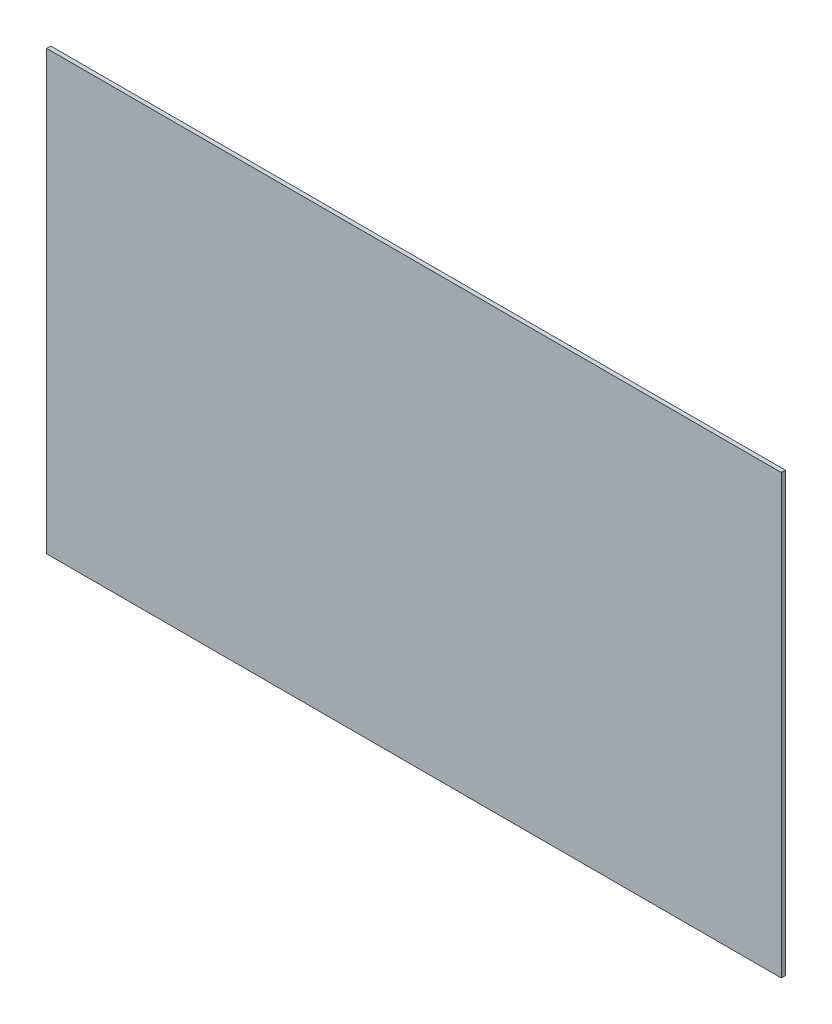
ISO-10303-21;
HEADER;
FILE_DESCRIPTION(('STEP AP214'),'2;1');
FILE_NAME('part.step','',(''),(''),'','','');
FILE_SCHEMA(('AUTOMOTIVE_DESIGN { 1 0 10303 214 1 1 1 1 }'));
ENDSEC;
DATA;
#1=APPLICATION_CONTEXT('core data for automotive mechanical design processes');
#2=APPLICATION_PROTOCOL_DEFINITION('international standard','automotive_design',2000,#1);
#3=PRODUCT_CONTEXT('',#1,'mechanical');
#4=PRODUCT('Part','Part','',(#3));
#5=PRODUCT_RELATED_PRODUCT_CATEGORY('part','',(#4));
#6=PRODUCT_DEFINITION_FORMATION('','',#4);
#7=PRODUCT_DEFINITION_CONTEXT('part definition',#1,'design');
#8=PRODUCT_DEFINITION('design','',#6,#7);
#9=PRODUCT_DEFINITION_SHAPE('','',#8);
#10=(LENGTH_UNIT() NAMED_UNIT(*) SI_UNIT(.MILLI.,.METRE.));
#11=(NAMED_UNIT(*) PLANE_ANGLE_UNIT() SI_UNIT($,.RADIAN.));
#12=(NAMED_UNIT(*) SI_UNIT($,.STERADIAN.) SOLID_ANGLE_UNIT());
#13=UNCERTAINTY_MEASURE_WITH_UNIT(LENGTH_MEASURE(1.E-05),#10,'distance_accuracy_value','');
#14=(GEOMETRIC_REPRESENTATION_CONTEXT(3) GLOBAL_UNCERTAINTY_ASSIGNED_CONTEXT((#13)) GLOBAL_UNIT_ASSIGNED_CONTEXT((#10,
#11,#12)) REPRESENTATION_CONTEXT('',''));
#15=CARTESIAN_POINT('',(0.,0.,0.));
#16=DIRECTION('',(0.,0.,1.));
#17=DIRECTION('',(1.,0.,0.));
#18=AXIS2_PLACEMENT_3D('',#15,#16,#17);
#19=CARTESIAN_POINT('',(268.5,160.,3.));
#20=DIRECTION('',(-1.,0.,0.));
#21=DIRECTION('',(0.,-1.,0.));
#22=AXIS2_PLACEMENT_3D('',#19,#20,#21);
#23=PLANE('',#22);
#24=DIRECTION('',(0.,1.,0.));
#25=VECTOR('',#24,1.);
#26=CARTESIAN_POINT('',(268.5,160.,0.));
#27=LINE('',#26,#25);
#28=CARTESIAN_POINT('',(268.5,-160.,0.));
#29=VERTEX_POINT('',#28);
#30=CARTESIAN_POINT('',(268.5,160.,0.));
#31=VERTEX_POINT('',#30);
#32=EDGE_CURVE('E99',#29,#31,#27,.T.);
#33=ORIENTED_EDGE('',*,*,#32,.T.);
#34=DIRECTION('',(0.,0.,-1.));
#35=VECTOR('',#34,1.);
#36=CARTESIAN_POINT('',(268.5,160.,3.));
#37=LINE('',#36,#35);
#38=CARTESIAN_POINT('',(268.5,160.,3.));
#39=VERTEX_POINT('',#38);
#40=EDGE_CURVE('E11',#39,#31,#37,.T.);
#41=ORIENTED_EDGE('',*,*,#40,.F.);
#42=DIRECTION('',(0.,1.,0.));
#43=VECTOR('',#42,1.);
#44=CARTESIAN_POINT('',(268.5,160.,3.));
#45=LINE('',#44,#43);
#46=CARTESIAN_POINT('',(268.5,-160.,3.));
#47=VERTEX_POINT('',#46);
#48=EDGE_CURVE('E87',#47,#39,#45,.T.);
#49=ORIENTED_EDGE('',*,*,#48,.F.);
#50=DIRECTION('',(0.,0.,-1.));
#51=VECTOR('',#50,1.);
#52=CARTESIAN_POINT('',(268.5,-160.,3.));
#53=LINE('',#52,#51);
#54=EDGE_CURVE('E95',#47,#29,#53,.T.);
#55=ORIENTED_EDGE('',*,*,#54,.T.);
#56=EDGE_LOOP('',(#33,#41,#49,#55));
#57=FACE_BOUND('',#56,.T.);
#58=ADVANCED_FACE('F36',(#57),#23,.F.);
#59=CARTESIAN_POINT('',(-268.5,160.,3.));
#60=DIRECTION('',(0.,-1.,0.));
#61=DIRECTION('',(0.,0.,-1.));
#62=AXIS2_PLACEMENT_3D('',#59,#60,#61);
#63=PLANE('',#62);
#64=DIRECTION('',(-1.,0.,0.));
#65=VECTOR('',#64,1.);
#66=CARTESIAN_POINT('',(-268.5,160.,0.));
#67=LINE('',#66,#65);
#68=CARTESIAN_POINT('',(-268.5,160.,0.));
#69=VERTEX_POINT('',#68);
#70=EDGE_CURVE('E91',#31,#69,#67,.T.);
#71=ORIENTED_EDGE('',*,*,#70,.T.);
#72=DIRECTION('',(0.,0.,-1.));
#73=VECTOR('',#72,1.);
#74=CARTESIAN_POINT('',(-268.5,160.,3.));
#75=LINE('',#74,#73);
#76=CARTESIAN_POINT('',(-268.5,160.,3.));
#77=VERTEX_POINT('',#76);
#78=EDGE_CURVE('E44',#77,#69,#75,.T.);
#79=ORIENTED_EDGE('',*,*,#78,.F.);
#80=DIRECTION('',(-1.,0.,0.));
#81=VECTOR('',#80,1.);
#82=CARTESIAN_POINT('',(-268.5,160.,3.));
#83=LINE('',#82,#81);
#84=EDGE_CURVE('E82',#39,#77,#83,.T.);
#85=ORIENTED_EDGE('',*,*,#84,.F.);
#86=ORIENTED_EDGE('',*,*,#40,.T.);
#87=EDGE_LOOP('',(#71,#79,#85,#86));
#88=FACE_BOUND('',#87,.T.);
#89=ADVANCED_FACE('F90',(#88),#63,.F.);
#90=CARTESIAN_POINT('',(-268.5,160.,3.));
#91=DIRECTION('',(1.,0.,0.));
#92=DIRECTION('',(0.,1.,0.));
#93=AXIS2_PLACEMENT_3D('',#90,#91,#92);
#94=PLANE('',#93);
#95=DIRECTION('',(0.,-1.,0.));
#96=VECTOR('',#95,1.);
#97=CARTESIAN_POINT('',(-268.5,160.,0.));
#98=LINE('',#97,#96);
#99=CARTESIAN_POINT('',(-268.5,-160.,0.));
#100=VERTEX_POINT('',#99);
#101=EDGE_CURVE('E69',#69,#100,#98,.T.);
#102=ORIENTED_EDGE('',*,*,#101,.T.);
#103=DIRECTION('',(0.,0.,-1.));
#104=VECTOR('',#103,1.);
#105=CARTESIAN_POINT('',(-268.5,-160.,3.));
#106=LINE('',#105,#104);
#107=CARTESIAN_POINT('',(-268.5,-160.,3.));
#108=VERTEX_POINT('',#107);
#109=EDGE_CURVE('E92',#108,#100,#106,.T.);
#110=ORIENTED_EDGE('',*,*,#109,.F.);
#111=DIRECTION('',(0.,-1.,0.));
#112=VECTOR('',#111,1.);
#113=CARTESIAN_POINT('',(-268.5,160.,3.));
#114=LINE('',#113,#112);
#115=EDGE_CURVE('E85',#77,#108,#114,.T.);
#116=ORIENTED_EDGE('',*,*,#115,.F.);
#117=ORIENTED_EDGE('',*,*,#78,.T.);
#118=EDGE_LOOP('',(#102,#110,#116,#117));
#119=FACE_BOUND('',#118,.T.);
#120=ADVANCED_FACE('F93',(#119),#94,.F.);
#121=CARTESIAN_POINT('',(-268.5,-160.,3.));
#122=DIRECTION('',(0.,1.,0.));
#123=DIRECTION('',(0.,0.,1.));
#124=AXIS2_PLACEMENT_3D('',#121,#122,#123);
#125=PLANE('',#124);
#126=DIRECTION('',(1.,0.,0.));
#127=VECTOR('',#126,1.);
#128=CARTESIAN_POINT('',(-268.5,-160.,0.));
#129=LINE('',#128,#127);
#130=EDGE_CURVE('E75',#100,#29,#129,.T.);
#131=ORIENTED_EDGE('',*,*,#130,.T.);
#132=ORIENTED_EDGE('',*,*,#54,.F.);
#133=DIRECTION('',(1.,0.,0.));
#134=VECTOR('',#133,1.);
#135=CARTESIAN_POINT('',(-268.5,-160.,3.));
#136=LINE('',#135,#134);
#137=EDGE_CURVE('E52',#108,#47,#136,.T.);
#138=ORIENTED_EDGE('',*,*,#137,.F.);
#139=ORIENTED_EDGE('',*,*,#109,.T.);
#140=EDGE_LOOP('',(#131,#132,#138,#139));
#141=FACE_BOUND('',#140,.T.);
#142=ADVANCED_FACE('F106',(#141),#125,.F.);
#143=CARTESIAN_POINT('',(0.,0.,3.));
#144=DIRECTION('',(0.,0.,1.));
#145=DIRECTION('',(1.,0.,0.));
#146=AXIS2_PLACEMENT_3D('',#143,#144,#145);
#147=PLANE('',#146);
#148=ORIENTED_EDGE('',*,*,#48,.T.);
#149=ORIENTED_EDGE('',*,*,#84,.T.);
#150=ORIENTED_EDGE('',*,*,#115,.T.);
#151=ORIENTED_EDGE('',*,*,#137,.T.);
#152=EDGE_LOOP('',(#148,#149,#150,#151));
#153=FACE_BOUND('',#152,.T.);
#154=ADVANCED_FACE('F83',(#153),#147,.T.);
#155=CARTESIAN_POINT('',(0.,0.,0.));
#156=DIRECTION('',(0.,0.,1.));
#157=DIRECTION('',(1.,0.,0.));
#158=AXIS2_PLACEMENT_3D('',#155,#156,#157);
#159=PLANE('',#158);
#160=ORIENTED_EDGE('',*,*,#32,.F.);
#161=ORIENTED_EDGE('',*,*,#130,.F.);
#162=ORIENTED_EDGE('',*,*,#101,.F.);
#163=ORIENTED_EDGE('',*,*,#70,.F.);
#164=EDGE_LOOP('',(#160,#161,#162,#163));
#165=FACE_BOUND('',#164,.T.);
#166=ADVANCED_FACE('F109',(#165),#159,.F.);
#167=CLOSED_SHELL('',(#58,#89,#120,#142,#154,#166));
#168=MANIFOLD_SOLID_BREP('B2',#167);
#169=ADVANCED_BREP_SHAPE_REPRESENTATION('',(#18,#168),#14);
#170=SHAPE_DEFINITION_REPRESENTATION(#9,#169);
ENDSEC;
END-ISO-10303-21;
